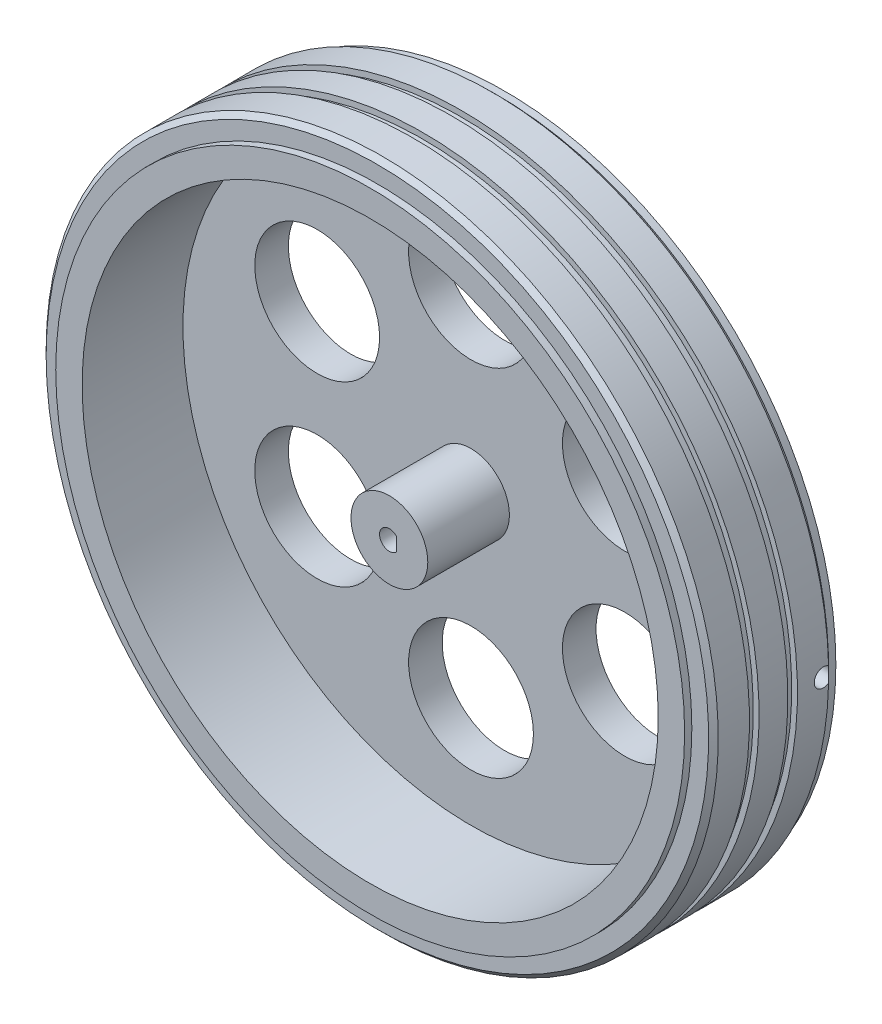
ISO-10303-21;
HEADER;
FILE_DESCRIPTION(('STEP AP214'),'2;1');
FILE_NAME('part.step','',(''),(''),'','','');
FILE_SCHEMA(('AUTOMOTIVE_DESIGN { 1 0 10303 214 1 1 1 1 }'));
ENDSEC;
DATA;
#1=APPLICATION_CONTEXT('core data for automotive mechanical design processes');
#2=APPLICATION_PROTOCOL_DEFINITION('international standard','automotive_design',2000,#1);
#3=PRODUCT_CONTEXT('',#1,'mechanical');
#4=PRODUCT('Part','Part','',(#3));
#5=PRODUCT_RELATED_PRODUCT_CATEGORY('part','',(#4));
#6=PRODUCT_DEFINITION_FORMATION('','',#4);
#7=PRODUCT_DEFINITION_CONTEXT('part definition',#1,'design');
#8=PRODUCT_DEFINITION('design','',#6,#7);
#9=PRODUCT_DEFINITION_SHAPE('','',#8);
#10=(LENGTH_UNIT() NAMED_UNIT(*) SI_UNIT(.MILLI.,.METRE.));
#11=(NAMED_UNIT(*) PLANE_ANGLE_UNIT() SI_UNIT($,.RADIAN.));
#12=(NAMED_UNIT(*) SI_UNIT($,.STERADIAN.) SOLID_ANGLE_UNIT());
#13=UNCERTAINTY_MEASURE_WITH_UNIT(LENGTH_MEASURE(1.E-05),#10,'distance_accuracy_value','');
#14=(GEOMETRIC_REPRESENTATION_CONTEXT(3) GLOBAL_UNCERTAINTY_ASSIGNED_CONTEXT((#13)) GLOBAL_UNIT_ASSIGNED_CONTEXT((#10,
#11,#12)) REPRESENTATION_CONTEXT('',''));
#15=CARTESIAN_POINT('',(0.,0.,0.));
#16=DIRECTION('',(0.,0.,1.));
#17=DIRECTION('',(1.,0.,0.));
#18=AXIS2_PLACEMENT_3D('',#15,#16,#17);
#19=CARTESIAN_POINT('',(0.,0.,0.));
#20=DIRECTION('',(0.,0.,-1.));
#21=DIRECTION('',(-1.,0.,0.));
#22=AXIS2_PLACEMENT_3D('',#19,#20,#21);
#23=CYLINDRICAL_SURFACE('',#22,70.);
#24=CARTESIAN_POINT('',(0.,0.,9.));
#25=DIRECTION('',(0.,0.,-1.));
#26=DIRECTION('',(-1.,0.,0.));
#27=AXIS2_PLACEMENT_3D('',#24,#25,#26);
#28=CIRCLE('',#27,70.);
#29=CARTESIAN_POINT('',(-70.,0.,9.));
#30=VERTEX_POINT('',#29);
#31=EDGE_CURVE('E87',#30,#30,#28,.T.);
#32=ORIENTED_EDGE('',*,*,#31,.T.);
#33=EDGE_LOOP('',(#32));
#34=FACE_BOUND('',#33,.T.);
#35=CARTESIAN_POINT('',(0.,0.,2.5));
#36=DIRECTION('',(0.,0.,-1.));
#37=DIRECTION('',(-1.,0.,0.));
#38=AXIS2_PLACEMENT_3D('',#35,#36,#37);
#39=CIRCLE('',#38,70.);
#40=CARTESIAN_POINT('',(69.9828550432176,-1.54919333848297,2.5));
#41=VERTEX_POINT('',#40);
#42=CARTESIAN_POINT('',(69.9828550432176,1.54919333848316,2.50000000000005));
#43=VERTEX_POINT('',#42);
#44=EDGE_CURVE('E85',#41,#43,#39,.T.);
#45=ORIENTED_EDGE('',*,*,#44,.F.);
#46=CARTESIAN_POINT('',(69.9828550432176,-1.54919333848297,2.5));
#47=CARTESIAN_POINT('',(69.9821699950699,-1.5801340021469,2.54357614975485));
#48=CARTESIAN_POINT('',(69.9815057230291,-1.60922088594838,2.58843752146515));
#49=CARTESIAN_POINT('',(69.9802362062229,-1.66351438197364,2.68044780927643));
#50=CARTESIAN_POINT('',(69.9796309587392,-1.6887211729357,2.72759661987382));
#51=CARTESIAN_POINT('',(69.9779316695055,-1.75819283756116,2.87190332629973));
#52=CARTESIAN_POINT('',(69.9769517970483,-1.79640824288858,2.97206155341133));
#53=CARTESIAN_POINT('',(69.9754104239647,-1.85548287890554,3.177371336838));
#54=CARTESIAN_POINT('',(69.9748491216351,-1.87633388378002,3.28252523478481));
#55=CARTESIAN_POINT('',(69.974208127022,-1.90008974999773,3.49483479849327));
#56=CARTESIAN_POINT('',(69.9741283376153,-1.90299823042355,3.60199005619832));
#57=CARTESIAN_POINT('',(69.9744593309165,-1.89078742296584,3.81524349461538));
#58=CARTESIAN_POINT('',(69.9748700195424,-1.87567159245446,3.92134187411889));
#59=CARTESIAN_POINT('',(69.9761355208292,-1.82784676701289,4.12951167444869));
#60=CARTESIAN_POINT('',(69.9769904017315,-1.79513506880407,4.23158247392508));
#61=CARTESIAN_POINT('',(69.9790479473008,-1.71304532050085,4.42878404038143));
#62=CARTESIAN_POINT('',(69.980250617261,-1.66366701675153,4.52391470171018));
#63=CARTESIAN_POINT('',(69.9828680766323,-1.54964988274148,4.70453162577262));
#64=CARTESIAN_POINT('',(69.9842828531443,-1.48501198033212,4.79001847442605));
#65=CARTESIAN_POINT('',(69.9871656976668,-1.34228188104707,4.94895955281252));
#66=CARTESIAN_POINT('',(69.9886337841544,-1.26418498348774,5.02240956101865));
#67=CARTESIAN_POINT('',(69.9914573418898,-1.09676574665419,5.15515851542349));
#68=CARTESIAN_POINT('',(69.9928128107317,-1.0074431676667,5.21445715935547));
#69=CARTESIAN_POINT('',(69.9952584140288,-0.820100202444896,5.31722188137198));
#70=CARTESIAN_POINT('',(69.9963485281451,-0.72207915027324,5.36068674595205));
#71=CARTESIAN_POINT('',(69.9981403678773,-0.520128056057234,5.43054163115542));
#72=CARTESIAN_POINT('',(69.998842096478,-0.416198059431255,5.4569317830021));
#73=CARTESIAN_POINT('',(69.9997779050191,-0.205410885079069,5.49188167208642));
#74=CARTESIAN_POINT('',(70.0000121199809,-0.0985545615381522,5.50044655742378));
#75=CARTESIAN_POINT('',(69.9999869047689,0.115079392891074,5.49951751213647));
#76=CARTESIAN_POINT('',(69.9997274752964,0.221857023890941,5.49002360716173));
#77=CARTESIAN_POINT('',(69.9987443254946,0.43227862075402,5.45325123699736));
#78=CARTESIAN_POINT('',(69.9980207050109,0.535923255492567,5.42597659634831));
#79=CARTESIAN_POINT('',(69.996190788202,0.737162914267488,5.3544216502671));
#80=CARTESIAN_POINT('',(69.9950844892186,0.834757896275256,5.31014122670646));
#81=CARTESIAN_POINT('',(69.9926135697291,1.02114947267244,5.20582135426022));
#82=CARTESIAN_POINT('',(69.9912488961611,1.10994425406724,5.14577866733212));
#83=CARTESIAN_POINT('',(69.9884151488781,1.27619359691991,5.0116435473827));
#84=CARTESIAN_POINT('',(69.9869460770559,1.35364836390028,4.93755136904536));
#85=CARTESIAN_POINT('',(69.9840686144789,1.49504365705181,4.77739470803601));
#86=CARTESIAN_POINT('',(69.9826602408072,1.55898039817505,4.69132688333819));
#87=CARTESIAN_POINT('',(69.9800633354694,1.67150085522027,4.50967058580225));
#88=CARTESIAN_POINT('',(69.978874816893,1.7200836571235,4.41408154661232));
#89=CARTESIAN_POINT('',(69.9768518452718,1.80050925670676,4.21610219511737));
#90=CARTESIAN_POINT('',(69.976017382932,1.83235249385168,4.11371206144143));
#91=CARTESIAN_POINT('',(69.9747967411601,1.87839217589012,3.90505163831947));
#92=CARTESIAN_POINT('',(69.9744104976447,1.89259114346007,3.79878190579321));
#93=CARTESIAN_POINT('',(69.9741297695507,1.90294268993806,3.58539985792459));
#94=CARTESIAN_POINT('',(69.974235119634,1.89910133635394,3.47828783796744));
#95=CARTESIAN_POINT('',(69.9749251900655,1.87350106196241,3.26622215540905));
#96=CARTESIAN_POINT('',(69.975509984633,1.85173936703058,3.16126882955886));
#97=CARTESIAN_POINT('',(69.9770732557186,1.79167187537866,2.95911883798243));
#98=CARTESIAN_POINT('',(69.9780411672215,1.75380818380465,2.86179180816243));
#99=CARTESIAN_POINT('',(69.9797083198211,1.68550734717637,2.72148731200217));
#100=CARTESIAN_POINT('',(69.9803003723284,1.66080308424496,2.67563892804158));
#101=CARTESIAN_POINT('',(69.9815400634534,1.60771673856627,2.58612007363377));
#102=CARTESIAN_POINT('',(69.9821877055623,1.57933442476797,2.54244974024811));
#103=CARTESIAN_POINT('',(69.9828550432176,1.54919333848297,2.5));
#104=B_SPLINE_CURVE_WITH_KNOTS('',3,(#46,#47,#48,#49,#50,#51,#52,#53,#54,#55,#56,#57,#58,#59,
#60,#61,#62,#63,#64,#65,#66,#67,#68,#69,#70,#71,#72,#73,#74,#75,#76,#77,#78,#79,#80,#81,#82,#83,
#84,#85,#86,#87,#88,#89,#90,#91,#92,#93,#94,#95,#96,#97,#98,#99,#100,#101,#102,#103),
.UNSPECIFIED.,.F.,.F.,(4,2,2,2,2,2,2,2,2,2,2,2,2,2,2,2,2,2,2,2,2,2,2,2,2,2,2,2,4),(0.,
0.160245183234278,0.320482982489432,0.640450132563806,0.960568770496787,1.2806228370434,
1.60061552160209,1.92065738114699,2.24070411174083,2.5607313870821,2.8808706623929,
3.20101677512147,3.52118741876195,3.84135560178301,4.16143130447087,4.48150655253749,
4.80151297684569,5.12152162407768,5.44159606221454,5.76166469871489,6.08182283611079,
6.40200002890597,6.72216881564835,7.0422918212256,7.36230716742662,7.68237206231039,
7.99416511898878,8.15026430628806,8.30637330431985),.UNSPECIFIED.);
#105=EDGE_CURVE('E56',#41,#43,#104,.T.);
#106=ORIENTED_EDGE('',*,*,#105,.T.);
#107=EDGE_LOOP('',(#45,#106));
#108=FACE_BOUND('',#107,.T.);
#109=ADVANCED_FACE('F39',(#34,#108),#23,.T.);
#110=CARTESIAN_POINT('',(0.,0.,1.5));
#111=DIRECTION('',(0.,0.,1.));
#112=DIRECTION('',(1.,0.,0.));
#113=AXIS2_PLACEMENT_3D('',#110,#111,#112);
#114=CONICAL_SURFACE('',#113,69.,0.785398163397449);
#115=CARTESIAN_POINT('',(0.,0.,1.5));
#116=DIRECTION('',(0.,0.,-1.));
#117=DIRECTION('',(-1.,0.,0.));
#118=AXIS2_PLACEMENT_3D('',#115,#116,#117);
#119=CIRCLE('',#118,69.);
#120=CARTESIAN_POINT('',(-69.,0.,1.5));
#121=VERTEX_POINT('',#120);
#122=EDGE_CURVE('E86',#121,#121,#119,.T.);
#123=ORIENTED_EDGE('',*,*,#122,.F.);
#124=EDGE_LOOP('',(#123));
#125=FACE_BOUND('',#124,.T.);
#126=ORIENTED_EDGE('',*,*,#44,.T.);
#127=CARTESIAN_POINT('',(70.0618614089016,1.60312443684265,2.58020000000102));
#128=CARTESIAN_POINT('',(70.0103649027091,1.56987694829996,2.52795768278689));
#129=CARTESIAN_POINT('',(69.9598062504573,1.53363280426329,2.47660395768639));
#130=CARTESIAN_POINT('',(69.861201852264,1.45489908200549,2.37633891333623));
#131=CARTESIAN_POINT('',(69.8131562332716,1.4124091886847,2.32742771747968));
#132=CARTESIAN_POINT('',(69.7195955303959,1.3203200822724,2.23208153927656));
#133=CARTESIAN_POINT('',(69.6741231658258,1.27063294777587,2.18568870226736));
#134=CARTESIAN_POINT('',(69.5873786071604,1.16450349569158,2.09710192732147));
#135=CARTESIAN_POINT('',(69.5460991302684,1.10807327492316,2.05490071171204));
#136=CARTESIAN_POINT('',(69.4635040507623,0.98029980280764,1.97038841345152));
#137=CARTESIAN_POINT('',(69.4229261922631,0.907971493403353,1.92882176586317));
#138=CARTESIAN_POINT('',(69.3504251031049,0.755243240447246,1.85449608158922));
#139=CARTESIAN_POINT('',(69.3184688813635,0.674875726471143,1.82170347474918));
#140=CARTESIAN_POINT('',(69.2647333883496,0.506293274289845,1.76653235786714));
#141=CARTESIAN_POINT('',(69.2430655125736,0.418004223547319,1.74426784938691));
#142=CARTESIAN_POINT('',(69.2122573715644,0.236971698828772,1.71260423842379));
#143=CARTESIAN_POINT('',(69.2031128745193,0.144229740518087,1.70320079002339));
#144=CARTESIAN_POINT('',(69.1985559448456,-0.0293814509111089,1.6985151406893));
#145=CARTESIAN_POINT('',(69.2014596726076,-0.110167164528784,1.70150137423387));
#146=CARTESIAN_POINT('',(69.2170580810763,-0.269747107360204,1.7175377496512));
#147=CARTESIAN_POINT('',(69.2297519061269,-0.348541509993335,1.73058701201355));
#148=CARTESIAN_POINT('',(69.2634681204126,-0.499412624720823,1.76522886023765));
#149=CARTESIAN_POINT('',(69.284197860143,-0.571625857577555,1.78652121894165));
#150=CARTESIAN_POINT('',(69.3328271705982,-0.710859331809432,1.83643646350474));
#151=CARTESIAN_POINT('',(69.3607277056006,-0.777878873194996,1.86506033525195));
#152=CARTESIAN_POINT('',(69.435710566198,-0.933370086353513,1.94192401178284));
#153=CARTESIAN_POINT('',(69.4858969836775,-1.01878640391222,1.99332142351219));
#154=CARTESIAN_POINT('',(69.5954279840924,-1.17704544821442,2.1053364854949));
#155=CARTESIAN_POINT('',(69.6548052137996,-1.24984131137193,2.16598699227539));
#156=CARTESIAN_POINT('',(69.7710652006879,-1.3732599368279,2.2845559145276));
#157=CARTESIAN_POINT('',(69.827075792026,-1.42556614085173,2.34160997749472));
#158=CARTESIAN_POINT('',(69.9422753512076,-1.52094851990721,2.45879583703623));
#159=CARTESIAN_POINT('',(70.0014325305823,-1.56410083099041,2.51889663971056));
#160=CARTESIAN_POINT('',(70.0618614089016,-1.60312443684265,2.58020000000102));
#161=B_SPLINE_CURVE_WITH_KNOTS('',3,(#127,#128,#129,#130,#131,#132,#133,#134,#135,#136,#137,
#138,#139,#140,#141,#142,#143,#144,#145,#146,#147,#148,#149,#150,#151,#152,#153,#154,#155,#156,
#157,#158,#159,#160),.UNSPECIFIED.,.F.,.F.,(4,2,2,2,2,2,2,2,2,2,2,2,2,2,2,2,4),(0.,
0.241641699802038,0.483295594676179,0.728199231480255,0.972669937226258,1.24993009215615,
1.52611374621404,1.80522314603028,2.08423820787166,2.32566872488897,2.56707814322931,
2.80041620748989,3.03378566583141,3.36677653670548,3.70097858544183,3.98705270999943,
4.27064507669392),.UNSPECIFIED.);
#162=EDGE_CURVE('E11',#43,#41,#161,.T.);
#163=ORIENTED_EDGE('',*,*,#162,.T.);
#164=EDGE_LOOP('',(#126,#163));
#165=FACE_BOUND('',#164,.T.);
#166=ADVANCED_FACE('F88',(#125,#165),#114,.T.);
#167=CARTESIAN_POINT('',(9.,0.,3.6));
#168=DIRECTION('',(-1.,0.,0.));
#169=DIRECTION('',(0.,0.,1.));
#170=AXIS2_PLACEMENT_3D('',#167,#168,#169);
#171=CYLINDRICAL_SURFACE('',#170,1.3);
#172=CARTESIAN_POINT('',(1.5,0.,3.6));
#173=DIRECTION('',(-1.,0.,0.));
#174=DIRECTION('',(0.,-1.,0.));
#175=AXIS2_PLACEMENT_3D('',#172,#173,#174);
#176=CIRCLE('',#175,1.3);
#177=CARTESIAN_POINT('',(1.5,-1.3,3.6));
#178=VERTEX_POINT('',#177);
#179=EDGE_CURVE('E83',#178,#178,#176,.F.);
#180=ORIENTED_EDGE('',*,*,#179,.F.);
#181=EDGE_LOOP('',(#180));
#182=FACE_BOUND('',#181,.T.);
#183=CARTESIAN_POINT('',(8.5,0.,3.6));
#184=DIRECTION('',(1.,0.,0.));
#185=DIRECTION('',(0.,0.,-1.));
#186=AXIS2_PLACEMENT_3D('',#183,#184,#185);
#187=CIRCLE('',#186,1.3);
#188=CARTESIAN_POINT('',(8.5,0.,2.3));
#189=VERTEX_POINT('',#188);
#190=EDGE_CURVE('E84',#189,#189,#187,.T.);
#191=ORIENTED_EDGE('',*,*,#190,.T.);
#192=EDGE_LOOP('',(#191));
#193=FACE_BOUND('',#192,.T.);
#194=ADVANCED_FACE('F213',(#182,#193),#171,.F.);
#195=CARTESIAN_POINT('',(0.,0.,0.));
#196=DIRECTION('',(0.,0.,1.));
#197=DIRECTION('',(1.,0.,0.));
#198=AXIS2_PLACEMENT_3D('',#195,#196,#197);
#199=PLANE('',#198);
#200=CARTESIAN_POINT('',(0.,0.,0.));
#201=DIRECTION('',(0.,0.,1.));
#202=DIRECTION('',(1.,0.,0.));
#203=AXIS2_PLACEMENT_3D('',#200,#201,#202);
#204=CIRCLE('',#203,69.);
#205=CARTESIAN_POINT('',(69.,0.,0.));
#206=VERTEX_POINT('',#205);
#207=EDGE_CURVE('E94',#206,#206,#204,.T.);
#208=ORIENTED_EDGE('',*,*,#207,.F.);
#209=EDGE_LOOP('',(#208));
#210=FACE_BOUND('',#209,.T.);
#211=CARTESIAN_POINT('',(0.,0.,0.));
#212=DIRECTION('',(0.,0.,1.));
#213=DIRECTION('',(1.,0.,0.));
#214=AXIS2_PLACEMENT_3D('',#211,#212,#213);
#215=CIRCLE('',#214,2.05);
#216=CARTESIAN_POINT('',(1.5,-1.39731886124821,0.));
#217=VERTEX_POINT('',#216);
#218=CARTESIAN_POINT('',(1.5,1.39731886124821,0.));
#219=VERTEX_POINT('',#218);
#220=EDGE_CURVE('E131',#217,#219,#215,.F.);
#221=ORIENTED_EDGE('',*,*,#220,.F.);
#222=DIRECTION('',(0.,-1.,0.));
#223=VECTOR('',#222,1.);
#224=CARTESIAN_POINT('',(1.5,0.,0.));
#225=LINE('',#224,#223);
#226=EDGE_CURVE('E133',#219,#217,#225,.T.);
#227=ORIENTED_EDGE('',*,*,#226,.F.);
#228=EDGE_LOOP('',(#221,#227));
#229=FACE_BOUND('',#228,.T.);
#230=CARTESIAN_POINT('',(32.0429399400242,-18.5,0.));
#231=DIRECTION('',(0.,0.,1.));
#232=DIRECTION('',(1.,0.,0.));
#233=AXIS2_PLACEMENT_3D('',#230,#231,#232);
#234=CIRCLE('',#233,13.);
#235=CARTESIAN_POINT('',(45.0429399400242,-18.5,0.));
#236=VERTEX_POINT('',#235);
#237=EDGE_CURVE('E156',#236,#236,#234,.F.);
#238=ORIENTED_EDGE('',*,*,#237,.F.);
#239=EDGE_LOOP('',(#238));
#240=FACE_BOUND('',#239,.T.);
#241=CARTESIAN_POINT('',(0.,-37.,0.));
#242=DIRECTION('',(0.,0.,1.));
#243=DIRECTION('',(1.,0.,0.));
#244=AXIS2_PLACEMENT_3D('',#241,#242,#243);
#245=CIRCLE('',#244,13.);
#246=CARTESIAN_POINT('',(13.,-37.,0.));
#247=VERTEX_POINT('',#246);
#248=EDGE_CURVE('E155',#247,#247,#245,.F.);
#249=ORIENTED_EDGE('',*,*,#248,.F.);
#250=EDGE_LOOP('',(#249));
#251=FACE_BOUND('',#250,.T.);
#252=CARTESIAN_POINT('',(-32.0429399400242,-18.5,0.));
#253=DIRECTION('',(0.,0.,1.));
#254=DIRECTION('',(1.,0.,0.));
#255=AXIS2_PLACEMENT_3D('',#252,#253,#254);
#256=CIRCLE('',#255,13.);
#257=CARTESIAN_POINT('',(-19.0429399400242,-18.5,0.));
#258=VERTEX_POINT('',#257);
#259=EDGE_CURVE('E146',#258,#258,#256,.F.);
#260=ORIENTED_EDGE('',*,*,#259,.F.);
#261=EDGE_LOOP('',(#260));
#262=FACE_BOUND('',#261,.T.);
#263=CARTESIAN_POINT('',(-32.0429399400242,18.5,0.));
#264=DIRECTION('',(0.,0.,1.));
#265=DIRECTION('',(1.,0.,0.));
#266=AXIS2_PLACEMENT_3D('',#263,#264,#265);
#267=CIRCLE('',#266,13.);
#268=CARTESIAN_POINT('',(-19.0429399400242,18.5,0.));
#269=VERTEX_POINT('',#268);
#270=EDGE_CURVE('E145',#269,#269,#267,.F.);
#271=ORIENTED_EDGE('',*,*,#270,.F.);
#272=EDGE_LOOP('',(#271));
#273=FACE_BOUND('',#272,.T.);
#274=CARTESIAN_POINT('',(0.,37.,0.));
#275=DIRECTION('',(0.,0.,1.));
#276=DIRECTION('',(1.,0.,0.));
#277=AXIS2_PLACEMENT_3D('',#274,#275,#276);
#278=CIRCLE('',#277,13.);
#279=CARTESIAN_POINT('',(13.,37.,0.));
#280=VERTEX_POINT('',#279);
#281=EDGE_CURVE('E136',#280,#280,#278,.F.);
#282=ORIENTED_EDGE('',*,*,#281,.F.);
#283=EDGE_LOOP('',(#282));
#284=FACE_BOUND('',#283,.T.);
#285=CARTESIAN_POINT('',(32.0429399400242,18.5,0.));
#286=DIRECTION('',(0.,0.,1.));
#287=DIRECTION('',(1.,0.,0.));
#288=AXIS2_PLACEMENT_3D('',#285,#286,#287);
#289=CIRCLE('',#288,13.);
#290=CARTESIAN_POINT('',(45.0429399400242,18.5,0.));
#291=VERTEX_POINT('',#290);
#292=EDGE_CURVE('E137',#291,#291,#289,.F.);
#293=ORIENTED_EDGE('',*,*,#292,.F.);
#294=EDGE_LOOP('',(#293));
#295=FACE_BOUND('',#294,.T.);
#296=ADVANCED_FACE('F41',(#210,#229,#240,#251,#262,#273,#284,#295),#199,.F.);
#297=CARTESIAN_POINT('',(0.,0.,24.));
#298=DIRECTION('',(0.,0.,1.));
#299=DIRECTION('',(1.,0.,0.));
#300=AXIS2_PLACEMENT_3D('',#297,#298,#299);
#301=PLANE('',#300);
#302=CARTESIAN_POINT('',(0.,0.,24.));
#303=DIRECTION('',(0.,0.,1.));
#304=DIRECTION('',(1.,0.,0.));
#305=AXIS2_PLACEMENT_3D('',#302,#303,#304);
#306=CIRCLE('',#305,8.);
#307=CARTESIAN_POINT('',(8.,0.,24.));
#308=VERTEX_POINT('',#307);
#309=EDGE_CURVE('E157',#308,#308,#306,.T.);
#310=ORIENTED_EDGE('',*,*,#309,.T.);
#311=EDGE_LOOP('',(#310));
#312=FACE_BOUND('',#311,.T.);
#313=DIRECTION('',(0.,-1.,0.));
#314=VECTOR('',#313,1.);
#315=CARTESIAN_POINT('',(1.5,0.,24.));
#316=LINE('',#315,#314);
#317=CARTESIAN_POINT('',(1.5,1.39731886124821,24.));
#318=VERTEX_POINT('',#317);
#319=CARTESIAN_POINT('',(1.5,-1.39731886124821,24.));
#320=VERTEX_POINT('',#319);
#321=EDGE_CURVE('E175',#318,#320,#316,.T.);
#322=ORIENTED_EDGE('',*,*,#321,.T.);
#323=CARTESIAN_POINT('',(0.,0.,24.));
#324=DIRECTION('',(0.,0.,1.));
#325=DIRECTION('',(1.,0.,0.));
#326=AXIS2_PLACEMENT_3D('',#323,#324,#325);
#327=CIRCLE('',#326,2.05);
#328=EDGE_CURVE('E52',#320,#318,#327,.F.);
#329=ORIENTED_EDGE('',*,*,#328,.T.);
#330=EDGE_LOOP('',(#322,#329));
#331=FACE_BOUND('',#330,.T.);
#332=ADVANCED_FACE('F231',(#312,#331),#301,.T.);
#333=CARTESIAN_POINT('',(0.,0.,28.));
#334=DIRECTION('',(0.,0.,1.));
#335=DIRECTION('',(1.,0.,0.));
#336=AXIS2_PLACEMENT_3D('',#333,#334,#335);
#337=PLANE('',#336);
#338=CARTESIAN_POINT('',(0.,0.,28.));
#339=DIRECTION('',(0.,0.,1.));
#340=DIRECTION('',(1.,0.,0.));
#341=AXIS2_PLACEMENT_3D('',#338,#339,#340);
#342=CIRCLE('',#341,65.5);
#343=CARTESIAN_POINT('',(65.5,0.,28.));
#344=VERTEX_POINT('',#343);
#345=EDGE_CURVE('E162',#344,#344,#342,.T.);
#346=ORIENTED_EDGE('',*,*,#345,.T.);
#347=EDGE_LOOP('',(#346));
#348=FACE_BOUND('',#347,.T.);
#349=CARTESIAN_POINT('',(0.,0.,28.));
#350=DIRECTION('',(0.,0.,1.));
#351=DIRECTION('',(1.,0.,0.));
#352=AXIS2_PLACEMENT_3D('',#349,#350,#351);
#353=CIRCLE('',#352,60.);
#354=CARTESIAN_POINT('',(60.,0.,28.));
#355=VERTEX_POINT('',#354);
#356=EDGE_CURVE('E167',#355,#355,#353,.T.);
#357=ORIENTED_EDGE('',*,*,#356,.F.);
#358=EDGE_LOOP('',(#357));
#359=FACE_BOUND('',#358,.T.);
#360=ADVANCED_FACE('F273',(#348,#359),#337,.T.);
#361=CARTESIAN_POINT('',(0.,0.,28.));
#362=DIRECTION('',(0.,0.,-1.));
#363=DIRECTION('',(-1.,0.,0.));
#364=AXIS2_PLACEMENT_3D('',#361,#362,#363);
#365=CYLINDRICAL_SURFACE('',#364,60.);
#366=CARTESIAN_POINT('',(0.,0.,7.));
#367=DIRECTION('',(0.,0.,1.));
#368=DIRECTION('',(1.,0.,0.));
#369=AXIS2_PLACEMENT_3D('',#366,#367,#368);
#370=CIRCLE('',#369,60.);
#371=CARTESIAN_POINT('',(60.,0.,7.));
#372=VERTEX_POINT('',#371);
#373=EDGE_CURVE('E166',#372,#372,#370,.T.);
#374=ORIENTED_EDGE('',*,*,#373,.F.);
#375=EDGE_LOOP('',(#374));
#376=FACE_BOUND('',#375,.T.);
#377=ORIENTED_EDGE('',*,*,#356,.T.);
#378=EDGE_LOOP('',(#377));
#379=FACE_BOUND('',#378,.T.);
#380=ADVANCED_FACE('F285',(#376,#379),#365,.F.);
#381=CARTESIAN_POINT('',(0.,0.,28.));
#382=DIRECTION('',(0.,0.,-1.));
#383=DIRECTION('',(-1.,0.,0.));
#384=AXIS2_PLACEMENT_3D('',#381,#382,#383);
#385=CYLINDRICAL_SURFACE('',#384,65.5);
#386=ORIENTED_EDGE('',*,*,#345,.F.);
#387=EDGE_LOOP('',(#386));
#388=FACE_BOUND('',#387,.T.);
#389=CARTESIAN_POINT('',(0.,0.,26.5));
#390=DIRECTION('',(0.,0.,1.));
#391=DIRECTION('',(1.,0.,0.));
#392=AXIS2_PLACEMENT_3D('',#389,#390,#391);
#393=CIRCLE('',#392,65.5);
#394=CARTESIAN_POINT('',(65.5,0.,26.5));
#395=VERTEX_POINT('',#394);
#396=EDGE_CURVE('E124',#395,#395,#393,.T.);
#397=ORIENTED_EDGE('',*,*,#396,.T.);
#398=EDGE_LOOP('',(#397));
#399=FACE_BOUND('',#398,.T.);
#400=ADVANCED_FACE('F279',(#388,#399),#385,.T.);
#401=CARTESIAN_POINT('',(0.,0.,7.));
#402=DIRECTION('',(0.,0.,1.));
#403=DIRECTION('',(1.,0.,0.));
#404=AXIS2_PLACEMENT_3D('',#401,#402,#403);
#405=PLANE('',#404);
#406=CARTESIAN_POINT('',(32.0429399400242,-18.5,7.));
#407=DIRECTION('',(0.,0.,1.));
#408=DIRECTION('',(1.,0.,0.));
#409=AXIS2_PLACEMENT_3D('',#406,#407,#408);
#410=CIRCLE('',#409,13.);
#411=CARTESIAN_POINT('',(45.0429399400242,-18.5,7.));
#412=VERTEX_POINT('',#411);
#413=EDGE_CURVE('E154',#412,#412,#410,.F.);
#414=ORIENTED_EDGE('',*,*,#413,.T.);
#415=EDGE_LOOP('',(#414));
#416=FACE_BOUND('',#415,.T.);
#417=CARTESIAN_POINT('',(0.,-37.,7.));
#418=DIRECTION('',(0.,0.,1.));
#419=DIRECTION('',(1.,0.,0.));
#420=AXIS2_PLACEMENT_3D('',#417,#418,#419);
#421=CIRCLE('',#420,13.);
#422=CARTESIAN_POINT('',(13.,-37.,7.));
#423=VERTEX_POINT('',#422);
#424=EDGE_CURVE('E151',#423,#423,#421,.F.);
#425=ORIENTED_EDGE('',*,*,#424,.T.);
#426=EDGE_LOOP('',(#425));
#427=FACE_BOUND('',#426,.T.);
#428=CARTESIAN_POINT('',(-32.0429399400242,-18.5,7.));
#429=DIRECTION('',(0.,0.,1.));
#430=DIRECTION('',(1.,0.,0.));
#431=AXIS2_PLACEMENT_3D('',#428,#429,#430);
#432=CIRCLE('',#431,13.);
#433=CARTESIAN_POINT('',(-19.0429399400242,-18.5,7.));
#434=VERTEX_POINT('',#433);
#435=EDGE_CURVE('E150',#434,#434,#432,.F.);
#436=ORIENTED_EDGE('',*,*,#435,.T.);
#437=EDGE_LOOP('',(#436));
#438=FACE_BOUND('',#437,.T.);
#439=CARTESIAN_POINT('',(-32.0429399400242,18.5,7.));
#440=DIRECTION('',(0.,0.,1.));
#441=DIRECTION('',(1.,0.,0.));
#442=AXIS2_PLACEMENT_3D('',#439,#440,#441);
#443=CIRCLE('',#442,13.);
#444=CARTESIAN_POINT('',(-19.0429399400242,18.5,7.));
#445=VERTEX_POINT('',#444);
#446=EDGE_CURVE('E141',#445,#445,#443,.F.);
#447=ORIENTED_EDGE('',*,*,#446,.T.);
#448=EDGE_LOOP('',(#447));
#449=FACE_BOUND('',#448,.T.);
#450=CARTESIAN_POINT('',(0.,37.,7.));
#451=DIRECTION('',(0.,0.,1.));
#452=DIRECTION('',(1.,0.,0.));
#453=AXIS2_PLACEMENT_3D('',#450,#451,#452);
#454=CIRCLE('',#453,13.);
#455=CARTESIAN_POINT('',(13.,37.,7.));
#456=VERTEX_POINT('',#455);
#457=EDGE_CURVE('E139',#456,#456,#454,.F.);
#458=ORIENTED_EDGE('',*,*,#457,.T.);
#459=EDGE_LOOP('',(#458));
#460=FACE_BOUND('',#459,.T.);
#461=CARTESIAN_POINT('',(32.0429399400242,18.5,7.));
#462=DIRECTION('',(0.,0.,1.));
#463=DIRECTION('',(1.,0.,0.));
#464=AXIS2_PLACEMENT_3D('',#461,#462,#463);
#465=CIRCLE('',#464,13.);
#466=CARTESIAN_POINT('',(45.0429399400242,18.5,7.));
#467=VERTEX_POINT('',#466);
#468=EDGE_CURVE('E132',#467,#467,#465,.F.);
#469=ORIENTED_EDGE('',*,*,#468,.T.);
#470=EDGE_LOOP('',(#469));
#471=FACE_BOUND('',#470,.T.);
#472=CARTESIAN_POINT('',(0.,0.,7.));
#473=DIRECTION('',(0.,0.,1.));
#474=DIRECTION('',(1.,0.,0.));
#475=AXIS2_PLACEMENT_3D('',#472,#473,#474);
#476=CIRCLE('',#475,8.);
#477=CARTESIAN_POINT('',(8.,0.,7.));
#478=VERTEX_POINT('',#477);
#479=EDGE_CURVE('E165',#478,#478,#476,.F.);
#480=ORIENTED_EDGE('',*,*,#479,.T.);
#481=EDGE_LOOP('',(#480));
#482=FACE_BOUND('',#481,.T.);
#483=ORIENTED_EDGE('',*,*,#373,.T.);
#484=EDGE_LOOP('',(#483));
#485=FACE_BOUND('',#484,.T.);
#486=ADVANCED_FACE('F264',(#416,#427,#438,#449,#460,#471,#482,#485),#405,.T.);
#487=CARTESIAN_POINT('',(0.,0.,24.));
#488=DIRECTION('',(0.,0.,-1.));
#489=DIRECTION('',(-1.,0.,0.));
#490=AXIS2_PLACEMENT_3D('',#487,#488,#489);
#491=CYLINDRICAL_SURFACE('',#490,8.);
#492=ORIENTED_EDGE('',*,*,#479,.F.);
#493=EDGE_LOOP('',(#492));
#494=FACE_BOUND('',#493,.T.);
#495=ORIENTED_EDGE('',*,*,#309,.F.);
#496=EDGE_LOOP('',(#495));
#497=FACE_BOUND('',#496,.T.);
#498=ADVANCED_FACE('F255',(#494,#497),#491,.T.);
#499=CARTESIAN_POINT('',(32.0429399400242,18.5,8.));
#500=DIRECTION('',(0.,0.,-1.));
#501=DIRECTION('',(-1.,0.,0.));
#502=AXIS2_PLACEMENT_3D('',#499,#500,#501);
#503=CYLINDRICAL_SURFACE('',#502,13.);
#504=ORIENTED_EDGE('',*,*,#468,.F.);
#505=EDGE_LOOP('',(#504));
#506=FACE_BOUND('',#505,.T.);
#507=ORIENTED_EDGE('',*,*,#292,.T.);
#508=EDGE_LOOP('',(#507));
#509=FACE_BOUND('',#508,.T.);
#510=ADVANCED_FACE('F253',(#506,#509),#503,.F.);
#511=CARTESIAN_POINT('',(0.,37.,8.));
#512=DIRECTION('',(0.,0.,-1.));
#513=DIRECTION('',(-1.,0.,0.));
#514=AXIS2_PLACEMENT_3D('',#511,#512,#513);
#515=CYLINDRICAL_SURFACE('',#514,13.);
#516=ORIENTED_EDGE('',*,*,#457,.F.);
#517=EDGE_LOOP('',(#516));
#518=FACE_BOUND('',#517,.T.);
#519=ORIENTED_EDGE('',*,*,#281,.T.);
#520=EDGE_LOOP('',(#519));
#521=FACE_BOUND('',#520,.T.);
#522=ADVANCED_FACE('F251',(#518,#521),#515,.F.);
#523=CARTESIAN_POINT('',(-32.0429399400242,18.5,8.));
#524=DIRECTION('',(0.,0.,-1.));
#525=DIRECTION('',(-1.,0.,0.));
#526=AXIS2_PLACEMENT_3D('',#523,#524,#525);
#527=CYLINDRICAL_SURFACE('',#526,13.);
#528=ORIENTED_EDGE('',*,*,#446,.F.);
#529=EDGE_LOOP('',(#528));
#530=FACE_BOUND('',#529,.T.);
#531=ORIENTED_EDGE('',*,*,#270,.T.);
#532=EDGE_LOOP('',(#531));
#533=FACE_BOUND('',#532,.T.);
#534=ADVANCED_FACE('F261',(#530,#533),#527,.F.);
#535=CARTESIAN_POINT('',(-32.0429399400242,-18.5,8.));
#536=DIRECTION('',(0.,0.,-1.));
#537=DIRECTION('',(-1.,0.,0.));
#538=AXIS2_PLACEMENT_3D('',#535,#536,#537);
#539=CYLINDRICAL_SURFACE('',#538,13.);
#540=ORIENTED_EDGE('',*,*,#435,.F.);
#541=EDGE_LOOP('',(#540));
#542=FACE_BOUND('',#541,.T.);
#543=ORIENTED_EDGE('',*,*,#259,.T.);
#544=EDGE_LOOP('',(#543));
#545=FACE_BOUND('',#544,.T.);
#546=ADVANCED_FACE('F370',(#542,#545),#539,.F.);
#547=CARTESIAN_POINT('',(0.,-37.,8.));
#548=DIRECTION('',(0.,0.,-1.));
#549=DIRECTION('',(-1.,0.,0.));
#550=AXIS2_PLACEMENT_3D('',#547,#548,#549);
#551=CYLINDRICAL_SURFACE('',#550,13.);
#552=ORIENTED_EDGE('',*,*,#424,.F.);
#553=EDGE_LOOP('',(#552));
#554=FACE_BOUND('',#553,.T.);
#555=ORIENTED_EDGE('',*,*,#248,.T.);
#556=EDGE_LOOP('',(#555));
#557=FACE_BOUND('',#556,.T.);
#558=ADVANCED_FACE('F367',(#554,#557),#551,.F.);
#559=CARTESIAN_POINT('',(32.0429399400242,-18.5,8.));
#560=DIRECTION('',(0.,0.,-1.));
#561=DIRECTION('',(-1.,0.,0.));
#562=AXIS2_PLACEMENT_3D('',#559,#560,#561);
#563=CYLINDRICAL_SURFACE('',#562,13.);
#564=ORIENTED_EDGE('',*,*,#413,.F.);
#565=EDGE_LOOP('',(#564));
#566=FACE_BOUND('',#565,.T.);
#567=ORIENTED_EDGE('',*,*,#237,.T.);
#568=EDGE_LOOP('',(#567));
#569=FACE_BOUND('',#568,.T.);
#570=ADVANCED_FACE('F271',(#566,#569),#563,.F.);
#571=CARTESIAN_POINT('',(0.,0.,29.));
#572=DIRECTION('',(0.,0.,-1.));
#573=DIRECTION('',(-1.,0.,0.));
#574=AXIS2_PLACEMENT_3D('',#571,#572,#573);
#575=CYLINDRICAL_SURFACE('',#574,2.05);
#576=ORIENTED_EDGE('',*,*,#220,.T.);
#577=DIRECTION('',(0.,0.,-1.));
#578=VECTOR('',#577,1.);
#579=CARTESIAN_POINT('',(1.5,1.39731886124821,29.));
#580=LINE('',#579,#578);
#581=EDGE_CURVE('E67',#318,#219,#580,.T.);
#582=ORIENTED_EDGE('',*,*,#581,.F.);
#583=ORIENTED_EDGE('',*,*,#328,.F.);
#584=DIRECTION('',(0.,0.,-1.));
#585=VECTOR('',#584,1.);
#586=CARTESIAN_POINT('',(1.5,-1.39731886124821,29.));
#587=LINE('',#586,#585);
#588=EDGE_CURVE('E126',#320,#217,#587,.T.);
#589=ORIENTED_EDGE('',*,*,#588,.T.);
#590=EDGE_LOOP('',(#576,#582,#583,#589));
#591=FACE_BOUND('',#590,.T.);
#592=ADVANCED_FACE('F356',(#591),#575,.F.);
#593=CARTESIAN_POINT('',(1.5,-1.39731886124821,29.));
#594=DIRECTION('',(-1.,0.,0.));
#595=DIRECTION('',(0.,-1.,0.));
#596=AXIS2_PLACEMENT_3D('',#593,#594,#595);
#597=PLANE('',#596);
#598=ORIENTED_EDGE('',*,*,#179,.T.);
#599=EDGE_LOOP('',(#598));
#600=FACE_BOUND('',#599,.T.);
#601=ORIENTED_EDGE('',*,*,#226,.T.);
#602=ORIENTED_EDGE('',*,*,#588,.F.);
#603=ORIENTED_EDGE('',*,*,#321,.F.);
#604=ORIENTED_EDGE('',*,*,#581,.T.);
#605=EDGE_LOOP('',(#601,#602,#603,#604));
#606=FACE_BOUND('',#605,.T.);
#607=ADVANCED_FACE('F302',(#600,#606),#597,.T.);
#608=CARTESIAN_POINT('',(0.,64.,26.5));
#609=DIRECTION('',(0.,0.,1.));
#610=DIRECTION('',(1.,0.,0.));
#611=AXIS2_PLACEMENT_3D('',#608,#609,#610);
#612=PLANE('',#611);
#613=ORIENTED_EDGE('',*,*,#396,.F.);
#614=EDGE_LOOP('',(#613));
#615=FACE_BOUND('',#614,.T.);
#616=CARTESIAN_POINT('',(0.,0.,26.5));
#617=DIRECTION('',(0.,0.,-1.));
#618=DIRECTION('',(-1.,0.,0.));
#619=AXIS2_PLACEMENT_3D('',#616,#617,#618);
#620=CIRCLE('',#619,69.);
#621=CARTESIAN_POINT('',(-69.,0.,26.5));
#622=VERTEX_POINT('',#621);
#623=EDGE_CURVE('E122',#622,#622,#620,.T.);
#624=ORIENTED_EDGE('',*,*,#623,.F.);
#625=EDGE_LOOP('',(#624));
#626=FACE_BOUND('',#625,.T.);
#627=ADVANCED_FACE('F300',(#615,#626),#612,.T.);
#628=CARTESIAN_POINT('',(0.,0.,25.5));
#629=DIRECTION('',(0.,0.,-1.));
#630=DIRECTION('',(-1.,0.,0.));
#631=AXIS2_PLACEMENT_3D('',#628,#629,#630);
#632=CONICAL_SURFACE('',#631,70.,0.78539816339745);
#633=ORIENTED_EDGE('',*,*,#623,.T.);
#634=EDGE_LOOP('',(#633));
#635=FACE_BOUND('',#634,.T.);
#636=CARTESIAN_POINT('',(0.,0.,25.5));
#637=DIRECTION('',(0.,0.,-1.));
#638=DIRECTION('',(-1.,0.,0.));
#639=AXIS2_PLACEMENT_3D('',#636,#637,#638);
#640=CIRCLE('',#639,70.);
#641=CARTESIAN_POINT('',(-70.,0.,25.5));
#642=VERTEX_POINT('',#641);
#643=EDGE_CURVE('E116',#642,#642,#640,.T.);
#644=ORIENTED_EDGE('',*,*,#643,.F.);
#645=EDGE_LOOP('',(#644));
#646=FACE_BOUND('',#645,.T.);
#647=ADVANCED_FACE('F297',(#635,#646),#632,.T.);
#648=CARTESIAN_POINT('',(0.,0.,0.));
#649=DIRECTION('',(0.,0.,-1.));
#650=DIRECTION('',(-1.,0.,0.));
#651=AXIS2_PLACEMENT_3D('',#648,#649,#650);
#652=CYLINDRICAL_SURFACE('',#651,70.);
#653=ORIENTED_EDGE('',*,*,#643,.T.);
#654=EDGE_LOOP('',(#653));
#655=FACE_BOUND('',#654,.T.);
#656=CARTESIAN_POINT('',(0.,0.,19.));
#657=DIRECTION('',(0.,0.,-1.));
#658=DIRECTION('',(-1.,0.,0.));
#659=AXIS2_PLACEMENT_3D('',#656,#657,#658);
#660=CIRCLE('',#659,70.);
#661=CARTESIAN_POINT('',(-70.,0.,19.));
#662=VERTEX_POINT('',#661);
#663=EDGE_CURVE('E113',#662,#662,#660,.T.);
#664=ORIENTED_EDGE('',*,*,#663,.F.);
#665=EDGE_LOOP('',(#664));
#666=FACE_BOUND('',#665,.T.);
#667=ADVANCED_FACE('F307',(#655,#666),#652,.T.);
#668=CARTESIAN_POINT('',(0.,70.,19.));
#669=DIRECTION('',(0.,0.,-1.));
#670=DIRECTION('',(-1.,0.,0.));
#671=AXIS2_PLACEMENT_3D('',#668,#669,#670);
#672=PLANE('',#671);
#673=ORIENTED_EDGE('',*,*,#663,.T.);
#674=EDGE_LOOP('',(#673));
#675=FACE_BOUND('',#674,.T.);
#676=CARTESIAN_POINT('',(0.,0.,19.));
#677=DIRECTION('',(0.,0.,-1.));
#678=DIRECTION('',(-1.,0.,0.));
#679=AXIS2_PLACEMENT_3D('',#676,#677,#678);
#680=CIRCLE('',#679,68.8);
#681=CARTESIAN_POINT('',(-68.8,0.,19.));
#682=VERTEX_POINT('',#681);
#683=EDGE_CURVE('E115',#682,#682,#680,.T.);
#684=ORIENTED_EDGE('',*,*,#683,.F.);
#685=EDGE_LOOP('',(#684));
#686=FACE_BOUND('',#685,.T.);
#687=ADVANCED_FACE('F311',(#675,#686),#672,.T.);
#688=CARTESIAN_POINT('',(0.,0.,0.));
#689=DIRECTION('',(0.,0.,-1.));
#690=DIRECTION('',(-1.,0.,0.));
#691=AXIS2_PLACEMENT_3D('',#688,#689,#690);
#692=CYLINDRICAL_SURFACE('',#691,68.8);
#693=ORIENTED_EDGE('',*,*,#683,.T.);
#694=EDGE_LOOP('',(#693));
#695=FACE_BOUND('',#694,.T.);
#696=CARTESIAN_POINT('',(0.,0.,17.));
#697=DIRECTION('',(0.,0.,-1.));
#698=DIRECTION('',(-1.,0.,0.));
#699=AXIS2_PLACEMENT_3D('',#696,#697,#698);
#700=CIRCLE('',#699,68.8);
#701=CARTESIAN_POINT('',(-68.8,0.,17.));
#702=VERTEX_POINT('',#701);
#703=EDGE_CURVE('E108',#702,#702,#700,.T.);
#704=ORIENTED_EDGE('',*,*,#703,.F.);
#705=EDGE_LOOP('',(#704));
#706=FACE_BOUND('',#705,.T.);
#707=ADVANCED_FACE('F317',(#695,#706),#692,.T.);
#708=CARTESIAN_POINT('',(0.,68.8,17.));
#709=DIRECTION('',(0.,0.,1.));
#710=DIRECTION('',(1.,0.,0.));
#711=AXIS2_PLACEMENT_3D('',#708,#709,#710);
#712=PLANE('',#711);
#713=ORIENTED_EDGE('',*,*,#703,.T.);
#714=EDGE_LOOP('',(#713));
#715=FACE_BOUND('',#714,.T.);
#716=CARTESIAN_POINT('',(0.,0.,17.));
#717=DIRECTION('',(0.,0.,-1.));
#718=DIRECTION('',(-1.,0.,0.));
#719=AXIS2_PLACEMENT_3D('',#716,#717,#718);
#720=CIRCLE('',#719,70.);
#721=CARTESIAN_POINT('',(-70.,0.,17.));
#722=VERTEX_POINT('',#721);
#723=EDGE_CURVE('E106',#722,#722,#720,.T.);
#724=ORIENTED_EDGE('',*,*,#723,.F.);
#725=EDGE_LOOP('',(#724));
#726=FACE_BOUND('',#725,.T.);
#727=ADVANCED_FACE('F324',(#715,#726),#712,.T.);
#728=CARTESIAN_POINT('',(0.,0.,0.));
#729=DIRECTION('',(0.,0.,-1.));
#730=DIRECTION('',(-1.,0.,0.));
#731=AXIS2_PLACEMENT_3D('',#728,#729,#730);
#732=CYLINDRICAL_SURFACE('',#731,70.);
#733=ORIENTED_EDGE('',*,*,#723,.T.);
#734=EDGE_LOOP('',(#733));
#735=FACE_BOUND('',#734,.T.);
#736=CARTESIAN_POINT('',(0.,0.,11.));
#737=DIRECTION('',(0.,0.,-1.));
#738=DIRECTION('',(-1.,0.,0.));
#739=AXIS2_PLACEMENT_3D('',#736,#737,#738);
#740=CIRCLE('',#739,70.);
#741=CARTESIAN_POINT('',(-70.,0.,11.));
#742=VERTEX_POINT('',#741);
#743=EDGE_CURVE('E103',#742,#742,#740,.T.);
#744=ORIENTED_EDGE('',*,*,#743,.F.);
#745=EDGE_LOOP('',(#744));
#746=FACE_BOUND('',#745,.T.);
#747=ADVANCED_FACE('F332',(#735,#746),#732,.T.);
#748=CARTESIAN_POINT('',(0.,70.,11.));
#749=DIRECTION('',(0.,0.,-1.));
#750=DIRECTION('',(-1.,0.,0.));
#751=AXIS2_PLACEMENT_3D('',#748,#749,#750);
#752=PLANE('',#751);
#753=ORIENTED_EDGE('',*,*,#743,.T.);
#754=EDGE_LOOP('',(#753));
#755=FACE_BOUND('',#754,.T.);
#756=CARTESIAN_POINT('',(0.,0.,11.));
#757=DIRECTION('',(0.,0.,-1.));
#758=DIRECTION('',(-1.,0.,0.));
#759=AXIS2_PLACEMENT_3D('',#756,#757,#758);
#760=CIRCLE('',#759,68.8);
#761=CARTESIAN_POINT('',(-68.8,0.,11.));
#762=VERTEX_POINT('',#761);
#763=EDGE_CURVE('E99',#762,#762,#760,.T.);
#764=ORIENTED_EDGE('',*,*,#763,.F.);
#765=EDGE_LOOP('',(#764));
#766=FACE_BOUND('',#765,.T.);
#767=ADVANCED_FACE('F340',(#755,#766),#752,.T.);
#768=CARTESIAN_POINT('',(0.,0.,0.));
#769=DIRECTION('',(0.,0.,-1.));
#770=DIRECTION('',(-1.,0.,0.));
#771=AXIS2_PLACEMENT_3D('',#768,#769,#770);
#772=CYLINDRICAL_SURFACE('',#771,68.8);
#773=ORIENTED_EDGE('',*,*,#763,.T.);
#774=EDGE_LOOP('',(#773));
#775=FACE_BOUND('',#774,.T.);
#776=CARTESIAN_POINT('',(0.,0.,9.));
#777=DIRECTION('',(0.,0.,-1.));
#778=DIRECTION('',(-1.,0.,0.));
#779=AXIS2_PLACEMENT_3D('',#776,#777,#778);
#780=CIRCLE('',#779,68.8);
#781=CARTESIAN_POINT('',(-68.8,0.,9.));
#782=VERTEX_POINT('',#781);
#783=EDGE_CURVE('E93',#782,#782,#780,.T.);
#784=ORIENTED_EDGE('',*,*,#783,.F.);
#785=EDGE_LOOP('',(#784));
#786=FACE_BOUND('',#785,.T.);
#787=ADVANCED_FACE('F343',(#775,#786),#772,.T.);
#788=CARTESIAN_POINT('',(0.,68.8,9.));
#789=DIRECTION('',(0.,0.,1.));
#790=DIRECTION('',(1.,0.,0.));
#791=AXIS2_PLACEMENT_3D('',#788,#789,#790);
#792=PLANE('',#791);
#793=ORIENTED_EDGE('',*,*,#783,.T.);
#794=EDGE_LOOP('',(#793));
#795=FACE_BOUND('',#794,.T.);
#796=ORIENTED_EDGE('',*,*,#31,.F.);
#797=EDGE_LOOP('',(#796));
#798=FACE_BOUND('',#797,.T.);
#799=ADVANCED_FACE('F218',(#795,#798),#792,.T.);
#800=CARTESIAN_POINT('',(0.,0.,1.5));
#801=DIRECTION('',(0.,0.,-1.));
#802=DIRECTION('',(-1.,0.,0.));
#803=AXIS2_PLACEMENT_3D('',#800,#801,#802);
#804=CYLINDRICAL_SURFACE('',#803,69.);
#805=ORIENTED_EDGE('',*,*,#122,.T.);
#806=EDGE_LOOP('',(#805));
#807=FACE_BOUND('',#806,.T.);
#808=ORIENTED_EDGE('',*,*,#207,.T.);
#809=EDGE_LOOP('',(#808));
#810=FACE_BOUND('',#809,.T.);
#811=ADVANCED_FACE('F215',(#807,#810),#804,.T.);
#812=CARTESIAN_POINT('',(71.,0.,3.6));
#813=DIRECTION('',(-1.,0.,0.));
#814=DIRECTION('',(0.,0.,1.));
#815=AXIS2_PLACEMENT_3D('',#812,#813,#814);
#816=CYLINDRICAL_SURFACE('',#815,1.9);
#817=ORIENTED_EDGE('',*,*,#162,.F.);
#818=ORIENTED_EDGE('',*,*,#105,.F.);
#819=EDGE_LOOP('',(#817,#818));
#820=FACE_BOUND('',#819,.T.);
#821=CARTESIAN_POINT('',(8.5,0.,3.6));
#822=DIRECTION('',(1.,0.,0.));
#823=DIRECTION('',(0.,0.,-1.));
#824=AXIS2_PLACEMENT_3D('',#821,#822,#823);
#825=CIRCLE('',#824,1.9);
#826=CARTESIAN_POINT('',(8.5,0.,1.7));
#827=VERTEX_POINT('',#826);
#828=EDGE_CURVE('E193',#827,#827,#825,.T.);
#829=ORIENTED_EDGE('',*,*,#828,.F.);
#830=EDGE_LOOP('',(#829));
#831=FACE_BOUND('',#830,.T.);
#832=ADVANCED_FACE('F78',(#820,#831),#816,.F.);
#833=CARTESIAN_POINT('',(8.5,0.,3.6));
#834=DIRECTION('',(1.,0.,0.));
#835=DIRECTION('',(0.,0.,-1.));
#836=AXIS2_PLACEMENT_3D('',#833,#834,#835);
#837=PLANE('',#836);
#838=ORIENTED_EDGE('',*,*,#190,.F.);
#839=EDGE_LOOP('',(#838));
#840=FACE_BOUND('',#839,.T.);
#841=ORIENTED_EDGE('',*,*,#828,.T.);
#842=EDGE_LOOP('',(#841));
#843=FACE_BOUND('',#842,.T.);
#844=ADVANCED_FACE('F211',(#840,#843),#837,.T.);
#845=CLOSED_SHELL('',(#109,#166,#194,#296,#332,#360,#380,#400,#486,#498,#510,#522,#534,#546,
#558,#570,#592,#607,#627,#647,#667,#687,#707,#727,#747,#767,#787,#799,#811,#832,#844));
#846=MANIFOLD_SOLID_BREP('B2',#845);
#847=ADVANCED_BREP_SHAPE_REPRESENTATION('',(#18,#846),#14);
#848=SHAPE_DEFINITION_REPRESENTATION(#9,#847);
ENDSEC;
END-ISO-10303-21;
